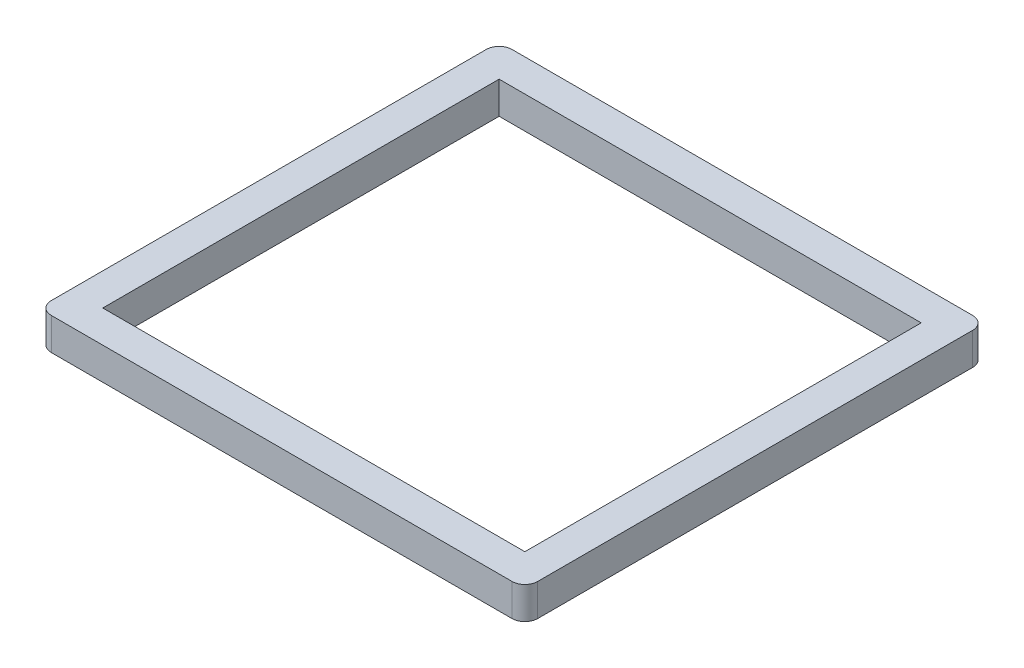
ISO-10303-21;
HEADER;
FILE_DESCRIPTION(('STEP AP214'),'2;1');
FILE_NAME('part.step','',(''),(''),'','','');
FILE_SCHEMA(('AUTOMOTIVE_DESIGN { 1 0 10303 214 1 1 1 1 }'));
ENDSEC;
DATA;
#1=APPLICATION_CONTEXT('core data for automotive mechanical design processes');
#2=APPLICATION_PROTOCOL_DEFINITION('international standard','automotive_design',2000,#1);
#3=PRODUCT_CONTEXT('',#1,'mechanical');
#4=PRODUCT('Part','Part','',(#3));
#5=PRODUCT_RELATED_PRODUCT_CATEGORY('part','',(#4));
#6=PRODUCT_DEFINITION_FORMATION('','',#4);
#7=PRODUCT_DEFINITION_CONTEXT('part definition',#1,'design');
#8=PRODUCT_DEFINITION('design','',#6,#7);
#9=PRODUCT_DEFINITION_SHAPE('','',#8);
#10=(LENGTH_UNIT() NAMED_UNIT(*) SI_UNIT(.MILLI.,.METRE.));
#11=(NAMED_UNIT(*) PLANE_ANGLE_UNIT() SI_UNIT($,.RADIAN.));
#12=(NAMED_UNIT(*) SI_UNIT($,.STERADIAN.) SOLID_ANGLE_UNIT());
#13=UNCERTAINTY_MEASURE_WITH_UNIT(LENGTH_MEASURE(1.E-05),#10,'distance_accuracy_value','');
#14=(GEOMETRIC_REPRESENTATION_CONTEXT(3) GLOBAL_UNCERTAINTY_ASSIGNED_CONTEXT((#13)) GLOBAL_UNIT_ASSIGNED_CONTEXT((#10,
#11,#12)) REPRESENTATION_CONTEXT('',''));
#15=CARTESIAN_POINT('',(0.,0.,0.));
#16=DIRECTION('',(0.,0.,1.));
#17=DIRECTION('',(1.,0.,0.));
#18=AXIS2_PLACEMENT_3D('',#15,#16,#17);
#19=CARTESIAN_POINT('',(-45.466,6.35,42.926));
#20=DIRECTION('',(0.,1.,0.));
#21=DIRECTION('',(0.,0.,1.));
#22=AXIS2_PLACEMENT_3D('',#19,#20,#21);
#23=PLANE('',#22);
#24=CARTESIAN_POINT('',(-45.466,6.35,42.926));
#25=DIRECTION('',(0.,1.,0.));
#26=DIRECTION('',(0.,0.,1.));
#27=AXIS2_PLACEMENT_3D('',#24,#25,#26);
#28=CIRCLE('',#27,2.54);
#29=CARTESIAN_POINT('',(-48.006,6.35,42.926));
#30=VERTEX_POINT('',#29);
#31=CARTESIAN_POINT('',(-45.466,6.35,45.466));
#32=VERTEX_POINT('',#31);
#33=EDGE_CURVE('E185',#30,#32,#28,.T.);
#34=ORIENTED_EDGE('',*,*,#33,.T.);
#35=DIRECTION('',(1.,0.,0.));
#36=VECTOR('',#35,1.);
#37=CARTESIAN_POINT('',(-45.466,6.35,45.466));
#38=LINE('',#37,#36);
#39=CARTESIAN_POINT('',(45.466,6.35,45.466));
#40=VERTEX_POINT('',#39);
#41=EDGE_CURVE('E189',#32,#40,#38,.T.);
#42=ORIENTED_EDGE('',*,*,#41,.T.);
#43=CARTESIAN_POINT('',(45.466,6.35,42.926));
#44=DIRECTION('',(0.,1.,0.));
#45=DIRECTION('',(0.,0.,1.));
#46=AXIS2_PLACEMENT_3D('',#43,#44,#45);
#47=CIRCLE('',#46,2.54);
#48=CARTESIAN_POINT('',(48.006,6.35,42.926));
#49=VERTEX_POINT('',#48);
#50=EDGE_CURVE('E193',#40,#49,#47,.T.);
#51=ORIENTED_EDGE('',*,*,#50,.T.);
#52=DIRECTION('',(0.,0.,-1.));
#53=VECTOR('',#52,1.);
#54=CARTESIAN_POINT('',(48.006,6.35,-42.926));
#55=LINE('',#54,#53);
#56=CARTESIAN_POINT('',(48.006,6.35,-42.926));
#57=VERTEX_POINT('',#56);
#58=EDGE_CURVE('E196',#49,#57,#55,.T.);
#59=ORIENTED_EDGE('',*,*,#58,.T.);
#60=CARTESIAN_POINT('',(45.466,6.35,-42.926));
#61=DIRECTION('',(0.,1.,0.));
#62=DIRECTION('',(0.,0.,-1.));
#63=AXIS2_PLACEMENT_3D('',#60,#61,#62);
#64=CIRCLE('',#63,2.54);
#65=CARTESIAN_POINT('',(45.466,6.35,-45.466));
#66=VERTEX_POINT('',#65);
#67=EDGE_CURVE('E199',#57,#66,#64,.T.);
#68=ORIENTED_EDGE('',*,*,#67,.T.);
#69=DIRECTION('',(-1.,0.,0.));
#70=VECTOR('',#69,1.);
#71=CARTESIAN_POINT('',(-45.466,6.35,-45.466));
#72=LINE('',#71,#70);
#73=CARTESIAN_POINT('',(-45.466,6.35,-45.466));
#74=VERTEX_POINT('',#73);
#75=EDGE_CURVE('E202',#66,#74,#72,.T.);
#76=ORIENTED_EDGE('',*,*,#75,.T.);
#77=CARTESIAN_POINT('',(-45.466,6.35,-42.926));
#78=DIRECTION('',(0.,1.,0.));
#79=DIRECTION('',(0.,0.,1.));
#80=AXIS2_PLACEMENT_3D('',#77,#78,#79);
#81=CIRCLE('',#80,2.54);
#82=CARTESIAN_POINT('',(-48.006,6.35,-42.926));
#83=VERTEX_POINT('',#82);
#84=EDGE_CURVE('E205',#74,#83,#81,.T.);
#85=ORIENTED_EDGE('',*,*,#84,.T.);
#86=DIRECTION('',(0.,0.,1.));
#87=VECTOR('',#86,1.);
#88=CARTESIAN_POINT('',(-48.006,6.35,-42.926));
#89=LINE('',#88,#87);
#90=EDGE_CURVE('E208',#83,#30,#89,.T.);
#91=ORIENTED_EDGE('',*,*,#90,.T.);
#92=EDGE_LOOP('',(#34,#42,#51,#59,#68,#76,#85,#91));
#93=FACE_BOUND('',#92,.T.);
#94=DIRECTION('',(1.,0.,0.));
#95=VECTOR('',#94,1.);
#96=CARTESIAN_POINT('',(-41.656,6.35,39.116));
#97=LINE('',#96,#95);
#98=CARTESIAN_POINT('',(-41.656,6.35,39.116));
#99=VERTEX_POINT('',#98);
#100=CARTESIAN_POINT('',(41.656,6.35,39.116));
#101=VERTEX_POINT('',#100);
#102=EDGE_CURVE('E146',#99,#101,#97,.T.);
#103=ORIENTED_EDGE('',*,*,#102,.F.);
#104=DIRECTION('',(0.,0.,1.));
#105=VECTOR('',#104,1.);
#106=CARTESIAN_POINT('',(-41.656,6.35,-39.116));
#107=LINE('',#106,#105);
#108=CARTESIAN_POINT('',(-41.656,6.35,-39.116));
#109=VERTEX_POINT('',#108);
#110=EDGE_CURVE('E137',#109,#99,#107,.T.);
#111=ORIENTED_EDGE('',*,*,#110,.F.);
#112=DIRECTION('',(-1.,0.,0.));
#113=VECTOR('',#112,1.);
#114=CARTESIAN_POINT('',(-41.656,6.35,-39.116));
#115=LINE('',#114,#113);
#116=CARTESIAN_POINT('',(41.656,6.35,-39.116));
#117=VERTEX_POINT('',#116);
#118=EDGE_CURVE('E163',#117,#109,#115,.T.);
#119=ORIENTED_EDGE('',*,*,#118,.F.);
#120=DIRECTION('',(0.,0.,-1.));
#121=VECTOR('',#120,1.);
#122=CARTESIAN_POINT('',(41.656,6.35,-39.116));
#123=LINE('',#122,#121);
#124=EDGE_CURVE('E159',#101,#117,#123,.T.);
#125=ORIENTED_EDGE('',*,*,#124,.F.);
#126=EDGE_LOOP('',(#103,#111,#119,#125));
#127=FACE_BOUND('',#126,.T.);
#128=ADVANCED_FACE('F47',(#93,#127),#23,.T.);
#129=CARTESIAN_POINT('',(-45.466,0.,42.926));
#130=DIRECTION('',(0.,1.,0.));
#131=DIRECTION('',(0.,0.,1.));
#132=AXIS2_PLACEMENT_3D('',#129,#130,#131);
#133=PLANE('',#132);
#134=CARTESIAN_POINT('',(-45.466,0.,42.926));
#135=DIRECTION('',(0.,1.,0.));
#136=DIRECTION('',(0.,0.,1.));
#137=AXIS2_PLACEMENT_3D('',#134,#135,#136);
#138=CIRCLE('',#137,2.54);
#139=CARTESIAN_POINT('',(-48.006,0.,42.926));
#140=VERTEX_POINT('',#139);
#141=CARTESIAN_POINT('',(-45.466,0.,45.466));
#142=VERTEX_POINT('',#141);
#143=EDGE_CURVE('E155',#140,#142,#138,.T.);
#144=ORIENTED_EDGE('',*,*,#143,.F.);
#145=DIRECTION('',(0.,0.,1.));
#146=VECTOR('',#145,1.);
#147=CARTESIAN_POINT('',(-48.006,0.,-42.926));
#148=LINE('',#147,#146);
#149=CARTESIAN_POINT('',(-48.006,0.,-42.926));
#150=VERTEX_POINT('',#149);
#151=EDGE_CURVE('E190',#150,#140,#148,.T.);
#152=ORIENTED_EDGE('',*,*,#151,.F.);
#153=CARTESIAN_POINT('',(-45.466,0.,-42.926));
#154=DIRECTION('',(0.,1.,0.));
#155=DIRECTION('',(0.,0.,1.));
#156=AXIS2_PLACEMENT_3D('',#153,#154,#155);
#157=CIRCLE('',#156,2.54);
#158=CARTESIAN_POINT('',(-45.466,0.,-45.466));
#159=VERTEX_POINT('',#158);
#160=EDGE_CURVE('E230',#159,#150,#157,.T.);
#161=ORIENTED_EDGE('',*,*,#160,.F.);
#162=DIRECTION('',(-1.,0.,0.));
#163=VECTOR('',#162,1.);
#164=CARTESIAN_POINT('',(-45.466,0.,-45.466));
#165=LINE('',#164,#163);
#166=CARTESIAN_POINT('',(45.466,0.,-45.466));
#167=VERTEX_POINT('',#166);
#168=EDGE_CURVE('E227',#167,#159,#165,.T.);
#169=ORIENTED_EDGE('',*,*,#168,.F.);
#170=CARTESIAN_POINT('',(45.466,0.,-42.926));
#171=DIRECTION('',(0.,1.,0.));
#172=DIRECTION('',(0.,0.,-1.));
#173=AXIS2_PLACEMENT_3D('',#170,#171,#172);
#174=CIRCLE('',#173,2.54);
#175=CARTESIAN_POINT('',(48.006,0.,-42.926));
#176=VERTEX_POINT('',#175);
#177=EDGE_CURVE('E224',#176,#167,#174,.T.);
#178=ORIENTED_EDGE('',*,*,#177,.F.);
#179=DIRECTION('',(0.,0.,-1.));
#180=VECTOR('',#179,1.);
#181=CARTESIAN_POINT('',(48.006,0.,-42.926));
#182=LINE('',#181,#180);
#183=CARTESIAN_POINT('',(48.006,0.,42.926));
#184=VERTEX_POINT('',#183);
#185=EDGE_CURVE('E221',#184,#176,#182,.T.);
#186=ORIENTED_EDGE('',*,*,#185,.F.);
#187=CARTESIAN_POINT('',(45.466,0.,42.926));
#188=DIRECTION('',(0.,1.,0.));
#189=DIRECTION('',(0.,0.,1.));
#190=AXIS2_PLACEMENT_3D('',#187,#188,#189);
#191=CIRCLE('',#190,2.54);
#192=CARTESIAN_POINT('',(45.466,0.,45.466));
#193=VERTEX_POINT('',#192);
#194=EDGE_CURVE('E218',#193,#184,#191,.T.);
#195=ORIENTED_EDGE('',*,*,#194,.F.);
#196=DIRECTION('',(1.,0.,0.));
#197=VECTOR('',#196,1.);
#198=CARTESIAN_POINT('',(-45.466,0.,45.466));
#199=LINE('',#198,#197);
#200=EDGE_CURVE('E215',#142,#193,#199,.T.);
#201=ORIENTED_EDGE('',*,*,#200,.F.);
#202=EDGE_LOOP('',(#144,#152,#161,#169,#178,#186,#195,#201));
#203=FACE_BOUND('',#202,.T.);
#204=DIRECTION('',(0.,0.,1.));
#205=VECTOR('',#204,1.);
#206=CARTESIAN_POINT('',(-41.656,0.,-39.116));
#207=LINE('',#206,#205);
#208=CARTESIAN_POINT('',(-41.656,0.,-39.116));
#209=VERTEX_POINT('',#208);
#210=CARTESIAN_POINT('',(-41.656,0.,39.116));
#211=VERTEX_POINT('',#210);
#212=EDGE_CURVE('E71',#209,#211,#207,.T.);
#213=ORIENTED_EDGE('',*,*,#212,.T.);
#214=DIRECTION('',(1.,0.,0.));
#215=VECTOR('',#214,1.);
#216=CARTESIAN_POINT('',(-41.656,0.,39.116));
#217=LINE('',#216,#215);
#218=CARTESIAN_POINT('',(41.656,0.,39.116));
#219=VERTEX_POINT('',#218);
#220=EDGE_CURVE('E153',#211,#219,#217,.T.);
#221=ORIENTED_EDGE('',*,*,#220,.T.);
#222=DIRECTION('',(0.,0.,-1.));
#223=VECTOR('',#222,1.);
#224=CARTESIAN_POINT('',(41.656,0.,-39.116));
#225=LINE('',#224,#223);
#226=CARTESIAN_POINT('',(41.656,0.,-39.116));
#227=VERTEX_POINT('',#226);
#228=EDGE_CURVE('E172',#219,#227,#225,.T.);
#229=ORIENTED_EDGE('',*,*,#228,.T.);
#230=DIRECTION('',(-1.,0.,0.));
#231=VECTOR('',#230,1.);
#232=CARTESIAN_POINT('',(-41.656,0.,-39.116));
#233=LINE('',#232,#231);
#234=EDGE_CURVE('E147',#227,#209,#233,.T.);
#235=ORIENTED_EDGE('',*,*,#234,.T.);
#236=EDGE_LOOP('',(#213,#221,#229,#235));
#237=FACE_BOUND('',#236,.T.);
#238=ADVANCED_FACE('F269',(#203,#237),#133,.F.);
#239=CARTESIAN_POINT('',(-45.466,6.35,42.926));
#240=DIRECTION('',(0.,-1.,0.));
#241=DIRECTION('',(0.,0.,-1.));
#242=AXIS2_PLACEMENT_3D('',#239,#240,#241);
#243=CYLINDRICAL_SURFACE('',#242,2.54);
#244=ORIENTED_EDGE('',*,*,#143,.T.);
#245=DIRECTION('',(0.,-1.,0.));
#246=VECTOR('',#245,1.);
#247=CARTESIAN_POINT('',(-45.466,6.35,45.466));
#248=LINE('',#247,#246);
#249=EDGE_CURVE('E11',#32,#142,#248,.T.);
#250=ORIENTED_EDGE('',*,*,#249,.F.);
#251=ORIENTED_EDGE('',*,*,#33,.F.);
#252=DIRECTION('',(0.,-1.,0.));
#253=VECTOR('',#252,1.);
#254=CARTESIAN_POINT('',(-48.006,6.35,42.926));
#255=LINE('',#254,#253);
#256=EDGE_CURVE('E211',#30,#140,#255,.T.);
#257=ORIENTED_EDGE('',*,*,#256,.T.);
#258=EDGE_LOOP('',(#244,#250,#251,#257));
#259=FACE_BOUND('',#258,.T.);
#260=ADVANCED_FACE('F49',(#259),#243,.T.);
#261=CARTESIAN_POINT('',(-45.466,6.35,45.466));
#262=DIRECTION('',(0.,0.,-1.));
#263=DIRECTION('',(-1.,0.,0.));
#264=AXIS2_PLACEMENT_3D('',#261,#262,#263);
#265=PLANE('',#264);
#266=ORIENTED_EDGE('',*,*,#200,.T.);
#267=DIRECTION('',(0.,-1.,0.));
#268=VECTOR('',#267,1.);
#269=CARTESIAN_POINT('',(45.466,6.35,45.466));
#270=LINE('',#269,#268);
#271=EDGE_CURVE('E56',#40,#193,#270,.T.);
#272=ORIENTED_EDGE('',*,*,#271,.F.);
#273=ORIENTED_EDGE('',*,*,#41,.F.);
#274=ORIENTED_EDGE('',*,*,#249,.T.);
#275=EDGE_LOOP('',(#266,#272,#273,#274));
#276=FACE_BOUND('',#275,.T.);
#277=ADVANCED_FACE('F286',(#276),#265,.F.);
#278=CARTESIAN_POINT('',(45.466,6.35,42.926));
#279=DIRECTION('',(0.,-1.,0.));
#280=DIRECTION('',(0.,0.,-1.));
#281=AXIS2_PLACEMENT_3D('',#278,#279,#280);
#282=CYLINDRICAL_SURFACE('',#281,2.54);
#283=ORIENTED_EDGE('',*,*,#194,.T.);
#284=DIRECTION('',(0.,-1.,0.));
#285=VECTOR('',#284,1.);
#286=CARTESIAN_POINT('',(48.006,6.35,42.926));
#287=LINE('',#286,#285);
#288=EDGE_CURVE('E254',#49,#184,#287,.T.);
#289=ORIENTED_EDGE('',*,*,#288,.F.);
#290=ORIENTED_EDGE('',*,*,#50,.F.);
#291=ORIENTED_EDGE('',*,*,#271,.T.);
#292=EDGE_LOOP('',(#283,#289,#290,#291));
#293=FACE_BOUND('',#292,.T.);
#294=ADVANCED_FACE('F263',(#293),#282,.T.);
#295=CARTESIAN_POINT('',(48.006,6.35,-42.926));
#296=DIRECTION('',(-1.,0.,0.));
#297=DIRECTION('',(0.,0.,1.));
#298=AXIS2_PLACEMENT_3D('',#295,#296,#297);
#299=PLANE('',#298);
#300=ORIENTED_EDGE('',*,*,#185,.T.);
#301=DIRECTION('',(0.,-1.,0.));
#302=VECTOR('',#301,1.);
#303=CARTESIAN_POINT('',(48.006,6.35,-42.926));
#304=LINE('',#303,#302);
#305=EDGE_CURVE('E250',#57,#176,#304,.T.);
#306=ORIENTED_EDGE('',*,*,#305,.F.);
#307=ORIENTED_EDGE('',*,*,#58,.F.);
#308=ORIENTED_EDGE('',*,*,#288,.T.);
#309=EDGE_LOOP('',(#300,#306,#307,#308));
#310=FACE_BOUND('',#309,.T.);
#311=ADVANCED_FACE('F275',(#310),#299,.F.);
#312=CARTESIAN_POINT('',(45.466,6.35,-42.926));
#313=DIRECTION('',(0.,-1.,0.));
#314=DIRECTION('',(0.,0.,-1.));
#315=AXIS2_PLACEMENT_3D('',#312,#313,#314);
#316=CYLINDRICAL_SURFACE('',#315,2.54);
#317=ORIENTED_EDGE('',*,*,#177,.T.);
#318=DIRECTION('',(0.,-1.,0.));
#319=VECTOR('',#318,1.);
#320=CARTESIAN_POINT('',(45.466,6.35,-45.466));
#321=LINE('',#320,#319);
#322=EDGE_CURVE('E246',#66,#167,#321,.T.);
#323=ORIENTED_EDGE('',*,*,#322,.F.);
#324=ORIENTED_EDGE('',*,*,#67,.F.);
#325=ORIENTED_EDGE('',*,*,#305,.T.);
#326=EDGE_LOOP('',(#317,#323,#324,#325));
#327=FACE_BOUND('',#326,.T.);
#328=ADVANCED_FACE('F279',(#327),#316,.T.);
#329=CARTESIAN_POINT('',(-45.466,6.35,-45.466));
#330=DIRECTION('',(0.,0.,1.));
#331=DIRECTION('',(1.,0.,0.));
#332=AXIS2_PLACEMENT_3D('',#329,#330,#331);
#333=PLANE('',#332);
#334=ORIENTED_EDGE('',*,*,#168,.T.);
#335=DIRECTION('',(0.,-1.,0.));
#336=VECTOR('',#335,1.);
#337=CARTESIAN_POINT('',(-45.466,6.35,-45.466));
#338=LINE('',#337,#336);
#339=EDGE_CURVE('E242',#74,#159,#338,.T.);
#340=ORIENTED_EDGE('',*,*,#339,.F.);
#341=ORIENTED_EDGE('',*,*,#75,.F.);
#342=ORIENTED_EDGE('',*,*,#322,.T.);
#343=EDGE_LOOP('',(#334,#340,#341,#342));
#344=FACE_BOUND('',#343,.T.);
#345=ADVANCED_FACE('F299',(#344),#333,.F.);
#346=CARTESIAN_POINT('',(-45.466,6.35,-42.926));
#347=DIRECTION('',(0.,-1.,0.));
#348=DIRECTION('',(0.,0.,-1.));
#349=AXIS2_PLACEMENT_3D('',#346,#347,#348);
#350=CYLINDRICAL_SURFACE('',#349,2.54);
#351=ORIENTED_EDGE('',*,*,#160,.T.);
#352=DIRECTION('',(0.,-1.,0.));
#353=VECTOR('',#352,1.);
#354=CARTESIAN_POINT('',(-48.006,6.35,-42.926));
#355=LINE('',#354,#353);
#356=EDGE_CURVE('E238',#83,#150,#355,.T.);
#357=ORIENTED_EDGE('',*,*,#356,.F.);
#358=ORIENTED_EDGE('',*,*,#84,.F.);
#359=ORIENTED_EDGE('',*,*,#339,.T.);
#360=EDGE_LOOP('',(#351,#357,#358,#359));
#361=FACE_BOUND('',#360,.T.);
#362=ADVANCED_FACE('F297',(#361),#350,.T.);
#363=CARTESIAN_POINT('',(-48.006,6.35,-42.926));
#364=DIRECTION('',(1.,0.,0.));
#365=DIRECTION('',(0.,0.,-1.));
#366=AXIS2_PLACEMENT_3D('',#363,#364,#365);
#367=PLANE('',#366);
#368=ORIENTED_EDGE('',*,*,#151,.T.);
#369=ORIENTED_EDGE('',*,*,#256,.F.);
#370=ORIENTED_EDGE('',*,*,#90,.F.);
#371=ORIENTED_EDGE('',*,*,#356,.T.);
#372=EDGE_LOOP('',(#368,#369,#370,#371));
#373=FACE_BOUND('',#372,.T.);
#374=ADVANCED_FACE('F292',(#373),#367,.F.);
#375=CARTESIAN_POINT('',(-41.656,6.35,-39.116));
#376=DIRECTION('',(1.,0.,0.));
#377=DIRECTION('',(0.,0.,-1.));
#378=AXIS2_PLACEMENT_3D('',#375,#376,#377);
#379=PLANE('',#378);
#380=ORIENTED_EDGE('',*,*,#212,.F.);
#381=DIRECTION('',(0.,-1.,0.));
#382=VECTOR('',#381,1.);
#383=CARTESIAN_POINT('',(-41.656,6.35,-39.116));
#384=LINE('',#383,#382);
#385=EDGE_CURVE('E141',#109,#209,#384,.T.);
#386=ORIENTED_EDGE('',*,*,#385,.F.);
#387=ORIENTED_EDGE('',*,*,#110,.T.);
#388=DIRECTION('',(0.,-1.,0.));
#389=VECTOR('',#388,1.);
#390=CARTESIAN_POINT('',(-41.656,6.35,39.116));
#391=LINE('',#390,#389);
#392=EDGE_CURVE('E140',#99,#211,#391,.T.);
#393=ORIENTED_EDGE('',*,*,#392,.T.);
#394=EDGE_LOOP('',(#380,#386,#387,#393));
#395=FACE_BOUND('',#394,.T.);
#396=ADVANCED_FACE('F139',(#395),#379,.T.);
#397=CARTESIAN_POINT('',(-41.656,6.35,39.116));
#398=DIRECTION('',(0.,0.,-1.));
#399=DIRECTION('',(-1.,0.,0.));
#400=AXIS2_PLACEMENT_3D('',#397,#398,#399);
#401=PLANE('',#400);
#402=ORIENTED_EDGE('',*,*,#220,.F.);
#403=ORIENTED_EDGE('',*,*,#392,.F.);
#404=ORIENTED_EDGE('',*,*,#102,.T.);
#405=DIRECTION('',(0.,-1.,0.));
#406=VECTOR('',#405,1.);
#407=CARTESIAN_POINT('',(41.656,6.35,39.116));
#408=LINE('',#407,#406);
#409=EDGE_CURVE('E156',#101,#219,#408,.T.);
#410=ORIENTED_EDGE('',*,*,#409,.T.);
#411=EDGE_LOOP('',(#402,#403,#404,#410));
#412=FACE_BOUND('',#411,.T.);
#413=ADVANCED_FACE('F150',(#412),#401,.T.);
#414=CARTESIAN_POINT('',(41.656,6.35,-39.116));
#415=DIRECTION('',(-1.,0.,0.));
#416=DIRECTION('',(0.,0.,1.));
#417=AXIS2_PLACEMENT_3D('',#414,#415,#416);
#418=PLANE('',#417);
#419=ORIENTED_EDGE('',*,*,#228,.F.);
#420=ORIENTED_EDGE('',*,*,#409,.F.);
#421=ORIENTED_EDGE('',*,*,#124,.T.);
#422=DIRECTION('',(0.,-1.,0.));
#423=VECTOR('',#422,1.);
#424=CARTESIAN_POINT('',(41.656,6.35,-39.116));
#425=LINE('',#424,#423);
#426=EDGE_CURVE('E63',#117,#227,#425,.T.);
#427=ORIENTED_EDGE('',*,*,#426,.T.);
#428=EDGE_LOOP('',(#419,#420,#421,#427));
#429=FACE_BOUND('',#428,.T.);
#430=ADVANCED_FACE('F324',(#429),#418,.T.);
#431=CARTESIAN_POINT('',(-41.656,6.35,-39.116));
#432=DIRECTION('',(0.,0.,1.));
#433=DIRECTION('',(1.,0.,0.));
#434=AXIS2_PLACEMENT_3D('',#431,#432,#433);
#435=PLANE('',#434);
#436=ORIENTED_EDGE('',*,*,#234,.F.);
#437=ORIENTED_EDGE('',*,*,#426,.F.);
#438=ORIENTED_EDGE('',*,*,#118,.T.);
#439=ORIENTED_EDGE('',*,*,#385,.T.);
#440=EDGE_LOOP('',(#436,#437,#438,#439));
#441=FACE_BOUND('',#440,.T.);
#442=ADVANCED_FACE('F328',(#441),#435,.T.);
#443=CLOSED_SHELL('',(#128,#238,#260,#277,#294,#311,#328,#345,#362,#374,#396,#413,#430,#442));
#444=MANIFOLD_SOLID_BREP('B2',#443);
#445=ADVANCED_BREP_SHAPE_REPRESENTATION('',(#18,#444),#14);
#446=SHAPE_DEFINITION_REPRESENTATION(#9,#445);
ENDSEC;
END-ISO-10303-21;
